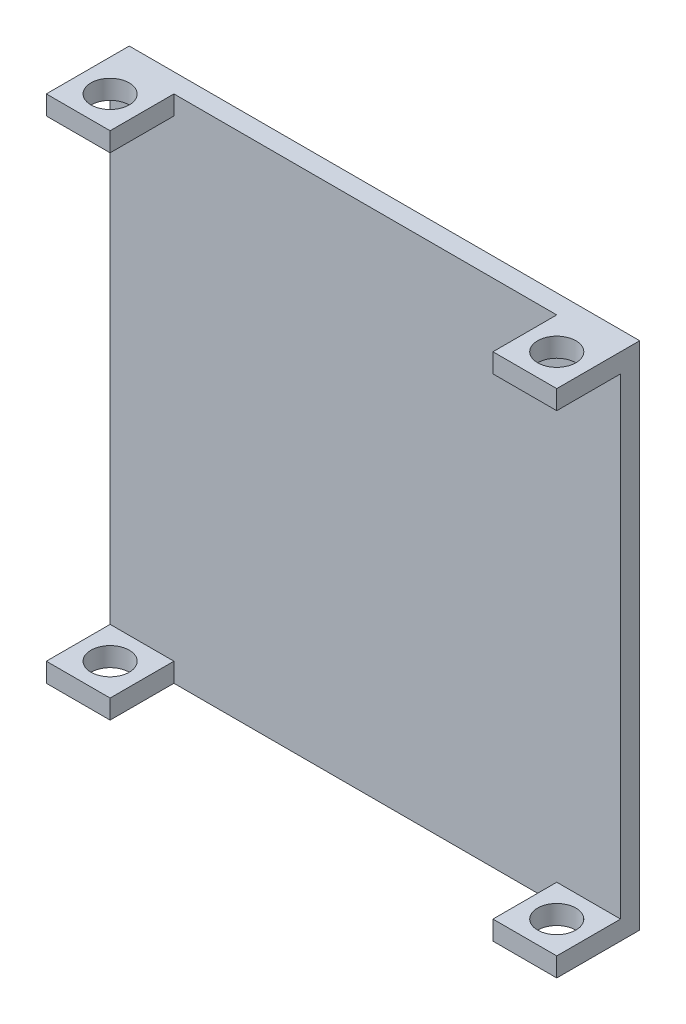
ISO-10303-21;
HEADER;
FILE_DESCRIPTION(('STEP AP214'),'2;1');
FILE_NAME('part.step','',(''),(''),'','','');
FILE_SCHEMA(('AUTOMOTIVE_DESIGN { 1 0 10303 214 1 1 1 1 }'));
ENDSEC;
DATA;
#1=APPLICATION_CONTEXT('core data for automotive mechanical design processes');
#2=APPLICATION_PROTOCOL_DEFINITION('international standard','automotive_design',2000,#1);
#3=PRODUCT_CONTEXT('',#1,'mechanical');
#4=PRODUCT('Part','Part','',(#3));
#5=PRODUCT_RELATED_PRODUCT_CATEGORY('part','',(#4));
#6=PRODUCT_DEFINITION_FORMATION('','',#4);
#7=PRODUCT_DEFINITION_CONTEXT('part definition',#1,'design');
#8=PRODUCT_DEFINITION('design','',#6,#7);
#9=PRODUCT_DEFINITION_SHAPE('','',#8);
#10=(LENGTH_UNIT() NAMED_UNIT(*) SI_UNIT(.MILLI.,.METRE.));
#11=(NAMED_UNIT(*) PLANE_ANGLE_UNIT() SI_UNIT($,.RADIAN.));
#12=(NAMED_UNIT(*) SI_UNIT($,.STERADIAN.) SOLID_ANGLE_UNIT());
#13=UNCERTAINTY_MEASURE_WITH_UNIT(LENGTH_MEASURE(1.E-05),#10,'distance_accuracy_value','');
#14=(GEOMETRIC_REPRESENTATION_CONTEXT(3) GLOBAL_UNCERTAINTY_ASSIGNED_CONTEXT((#13)) GLOBAL_UNIT_ASSIGNED_CONTEXT((#10,
#11,#12)) REPRESENTATION_CONTEXT('',''));
#15=CARTESIAN_POINT('',(0.,0.,0.));
#16=DIRECTION('',(0.,0.,1.));
#17=DIRECTION('',(1.,0.,0.));
#18=AXIS2_PLACEMENT_3D('',#15,#16,#17);
#19=CARTESIAN_POINT('',(0.,0.,3.));
#20=DIRECTION('',(0.,0.,-1.));
#21=DIRECTION('',(-1.,0.,0.));
#22=AXIS2_PLACEMENT_3D('',#19,#20,#21);
#23=PLANE('',#22);
#24=DIRECTION('',(1.,0.,0.));
#25=VECTOR('',#24,1.);
#26=CARTESIAN_POINT('',(40.,-40.,3.));
#27=LINE('',#26,#25);
#28=CARTESIAN_POINT('',(-30.,-40.,3.));
#29=VERTEX_POINT('',#28);
#30=CARTESIAN_POINT('',(30.,-40.,3.));
#31=VERTEX_POINT('',#30);
#32=EDGE_CURVE('E280',#29,#31,#27,.T.);
#33=ORIENTED_EDGE('',*,*,#32,.T.);
#34=DIRECTION('',(0.,-1.,0.));
#35=VECTOR('',#34,1.);
#36=CARTESIAN_POINT('',(30.,-37.,3.));
#37=LINE('',#36,#35);
#38=CARTESIAN_POINT('',(30.,-37.,3.));
#39=VERTEX_POINT('',#38);
#40=EDGE_CURVE('E50',#39,#31,#37,.T.);
#41=ORIENTED_EDGE('',*,*,#40,.F.);
#42=DIRECTION('',(1.,0.,0.));
#43=VECTOR('',#42,1.);
#44=CARTESIAN_POINT('',(40.,-37.,3.));
#45=LINE('',#44,#43);
#46=CARTESIAN_POINT('',(40.,-37.,3.));
#47=VERTEX_POINT('',#46);
#48=EDGE_CURVE('E54',#39,#47,#45,.T.);
#49=ORIENTED_EDGE('',*,*,#48,.T.);
#50=DIRECTION('',(0.,1.,0.));
#51=VECTOR('',#50,1.);
#52=CARTESIAN_POINT('',(40.,40.,3.));
#53=LINE('',#52,#51);
#54=CARTESIAN_POINT('',(40.,37.,3.));
#55=VERTEX_POINT('',#54);
#56=EDGE_CURVE('E168',#47,#55,#53,.T.);
#57=ORIENTED_EDGE('',*,*,#56,.T.);
#58=DIRECTION('',(-1.,0.,0.));
#59=VECTOR('',#58,1.);
#60=CARTESIAN_POINT('',(40.,37.,3.));
#61=LINE('',#60,#59);
#62=CARTESIAN_POINT('',(30.,37.,3.));
#63=VERTEX_POINT('',#62);
#64=EDGE_CURVE('E221',#55,#63,#61,.T.);
#65=ORIENTED_EDGE('',*,*,#64,.T.);
#66=DIRECTION('',(0.,1.,0.));
#67=VECTOR('',#66,1.);
#68=CARTESIAN_POINT('',(30.,37.,3.));
#69=LINE('',#68,#67);
#70=CARTESIAN_POINT('',(30.,40.,3.));
#71=VERTEX_POINT('',#70);
#72=EDGE_CURVE('E230',#63,#71,#69,.T.);
#73=ORIENTED_EDGE('',*,*,#72,.T.);
#74=DIRECTION('',(-1.,0.,0.));
#75=VECTOR('',#74,1.);
#76=CARTESIAN_POINT('',(40.,40.,3.));
#77=LINE('',#76,#75);
#78=CARTESIAN_POINT('',(-30.,40.,3.));
#79=VERTEX_POINT('',#78);
#80=EDGE_CURVE('E275',#71,#79,#77,.T.);
#81=ORIENTED_EDGE('',*,*,#80,.T.);
#82=DIRECTION('',(0.,1.,0.));
#83=VECTOR('',#82,1.);
#84=CARTESIAN_POINT('',(-30.,37.,3.));
#85=LINE('',#84,#83);
#86=CARTESIAN_POINT('',(-30.,37.,3.));
#87=VERTEX_POINT('',#86);
#88=EDGE_CURVE('E266',#87,#79,#85,.T.);
#89=ORIENTED_EDGE('',*,*,#88,.F.);
#90=DIRECTION('',(-1.,0.,0.));
#91=VECTOR('',#90,1.);
#92=CARTESIAN_POINT('',(-40.,37.,3.));
#93=LINE('',#92,#91);
#94=CARTESIAN_POINT('',(-40.,37.,3.));
#95=VERTEX_POINT('',#94);
#96=EDGE_CURVE('E258',#87,#95,#93,.T.);
#97=ORIENTED_EDGE('',*,*,#96,.T.);
#98=DIRECTION('',(0.,-1.,0.));
#99=VECTOR('',#98,1.);
#100=CARTESIAN_POINT('',(-40.,40.,3.));
#101=LINE('',#100,#99);
#102=CARTESIAN_POINT('',(-40.,-37.,3.));
#103=VERTEX_POINT('',#102);
#104=EDGE_CURVE('E278',#95,#103,#101,.T.);
#105=ORIENTED_EDGE('',*,*,#104,.T.);
#106=DIRECTION('',(1.,0.,0.));
#107=VECTOR('',#106,1.);
#108=CARTESIAN_POINT('',(-40.,-37.,3.));
#109=LINE('',#108,#107);
#110=CARTESIAN_POINT('',(-30.,-37.,3.));
#111=VERTEX_POINT('',#110);
#112=EDGE_CURVE('E188',#103,#111,#109,.T.);
#113=ORIENTED_EDGE('',*,*,#112,.T.);
#114=DIRECTION('',(0.,-1.,0.));
#115=VECTOR('',#114,1.);
#116=CARTESIAN_POINT('',(-30.,-37.,3.));
#117=LINE('',#116,#115);
#118=EDGE_CURVE('E200',#111,#29,#117,.T.);
#119=ORIENTED_EDGE('',*,*,#118,.T.);
#120=EDGE_LOOP('',(#33,#41,#49,#57,#65,#73,#81,#89,#97,#105,#113,#119));
#121=FACE_BOUND('',#120,.T.);
#122=ADVANCED_FACE('F35',(#121),#23,.F.);
#123=CARTESIAN_POINT('',(40.,40.,3.));
#124=DIRECTION('',(-1.,0.,0.));
#125=DIRECTION('',(0.,-1.,0.));
#126=AXIS2_PLACEMENT_3D('',#123,#124,#125);
#127=PLANE('',#126);
#128=DIRECTION('',(0.,1.,0.));
#129=VECTOR('',#128,1.);
#130=CARTESIAN_POINT('',(40.,40.,0.));
#131=LINE('',#130,#129);
#132=CARTESIAN_POINT('',(40.,-40.,0.));
#133=VERTEX_POINT('',#132);
#134=CARTESIAN_POINT('',(40.,40.,0.));
#135=VERTEX_POINT('',#134);
#136=EDGE_CURVE('E269',#133,#135,#131,.T.);
#137=ORIENTED_EDGE('',*,*,#136,.T.);
#138=DIRECTION('',(0.,0.,-1.));
#139=VECTOR('',#138,1.);
#140=CARTESIAN_POINT('',(40.,40.,3.));
#141=LINE('',#140,#139);
#142=CARTESIAN_POINT('',(40.,40.,13.));
#143=VERTEX_POINT('',#142);
#144=EDGE_CURVE('E11',#143,#135,#141,.T.);
#145=ORIENTED_EDGE('',*,*,#144,.F.);
#146=DIRECTION('',(0.,1.,0.));
#147=VECTOR('',#146,1.);
#148=CARTESIAN_POINT('',(40.,37.,13.));
#149=LINE('',#148,#147);
#150=CARTESIAN_POINT('',(40.,37.,13.));
#151=VERTEX_POINT('',#150);
#152=EDGE_CURVE('E235',#151,#143,#149,.T.);
#153=ORIENTED_EDGE('',*,*,#152,.F.);
#154=DIRECTION('',(0.,0.,-1.));
#155=VECTOR('',#154,1.);
#156=CARTESIAN_POINT('',(40.,37.,3.));
#157=LINE('',#156,#155);
#158=EDGE_CURVE('E219',#151,#55,#157,.T.);
#159=ORIENTED_EDGE('',*,*,#158,.T.);
#160=ORIENTED_EDGE('',*,*,#56,.F.);
#161=DIRECTION('',(0.,0.,1.));
#162=VECTOR('',#161,1.);
#163=CARTESIAN_POINT('',(40.,-37.,13.));
#164=LINE('',#163,#162);
#165=CARTESIAN_POINT('',(40.,-37.,13.));
#166=VERTEX_POINT('',#165);
#167=EDGE_CURVE('E163',#47,#166,#164,.T.);
#168=ORIENTED_EDGE('',*,*,#167,.T.);
#169=DIRECTION('',(0.,-1.,0.));
#170=VECTOR('',#169,1.);
#171=CARTESIAN_POINT('',(40.,-37.,13.));
#172=LINE('',#171,#170);
#173=CARTESIAN_POINT('',(40.,-40.,13.));
#174=VERTEX_POINT('',#173);
#175=EDGE_CURVE('E147',#166,#174,#172,.T.);
#176=ORIENTED_EDGE('',*,*,#175,.T.);
#177=DIRECTION('',(0.,0.,-1.));
#178=VECTOR('',#177,1.);
#179=CARTESIAN_POINT('',(40.,-40.,3.));
#180=LINE('',#179,#178);
#181=EDGE_CURVE('E282',#174,#133,#180,.T.);
#182=ORIENTED_EDGE('',*,*,#181,.T.);
#183=EDGE_LOOP('',(#137,#145,#153,#159,#160,#168,#176,#182));
#184=FACE_BOUND('',#183,.T.);
#185=ADVANCED_FACE('F37',(#184),#127,.F.);
#186=CARTESIAN_POINT('',(40.,40.,3.));
#187=DIRECTION('',(0.,-1.,0.));
#188=DIRECTION('',(0.,0.,-1.));
#189=AXIS2_PLACEMENT_3D('',#186,#187,#188);
#190=PLANE('',#189);
#191=DIRECTION('',(-1.,0.,0.));
#192=VECTOR('',#191,1.);
#193=CARTESIAN_POINT('',(40.,40.,0.));
#194=LINE('',#193,#192);
#195=CARTESIAN_POINT('',(-40.,40.,0.));
#196=VERTEX_POINT('',#195);
#197=EDGE_CURVE('E284',#135,#196,#194,.T.);
#198=ORIENTED_EDGE('',*,*,#197,.T.);
#199=DIRECTION('',(0.,0.,-1.));
#200=VECTOR('',#199,1.);
#201=CARTESIAN_POINT('',(-40.,40.,3.));
#202=LINE('',#201,#200);
#203=CARTESIAN_POINT('',(-40.,40.,13.));
#204=VERTEX_POINT('',#203);
#205=EDGE_CURVE('E43',#204,#196,#202,.T.);
#206=ORIENTED_EDGE('',*,*,#205,.F.);
#207=DIRECTION('',(1.,0.,0.));
#208=VECTOR('',#207,1.);
#209=CARTESIAN_POINT('',(-40.,40.,13.));
#210=LINE('',#209,#208);
#211=CARTESIAN_POINT('',(-30.,40.,13.));
#212=VERTEX_POINT('',#211);
#213=EDGE_CURVE('E246',#204,#212,#210,.T.);
#214=ORIENTED_EDGE('',*,*,#213,.T.);
#215=DIRECTION('',(0.,0.,-1.));
#216=VECTOR('',#215,1.);
#217=CARTESIAN_POINT('',(-30.,40.,3.));
#218=LINE('',#217,#216);
#219=EDGE_CURVE('E253',#212,#79,#218,.T.);
#220=ORIENTED_EDGE('',*,*,#219,.T.);
#221=ORIENTED_EDGE('',*,*,#80,.F.);
#222=DIRECTION('',(0.,0.,1.));
#223=VECTOR('',#222,1.);
#224=CARTESIAN_POINT('',(30.,40.,3.));
#225=LINE('',#224,#223);
#226=CARTESIAN_POINT('',(30.,40.,13.));
#227=VERTEX_POINT('',#226);
#228=EDGE_CURVE('E216',#71,#227,#225,.T.);
#229=ORIENTED_EDGE('',*,*,#228,.T.);
#230=DIRECTION('',(1.,0.,0.));
#231=VECTOR('',#230,1.);
#232=CARTESIAN_POINT('',(40.,40.,13.));
#233=LINE('',#232,#231);
#234=EDGE_CURVE('E222',#227,#143,#233,.T.);
#235=ORIENTED_EDGE('',*,*,#234,.T.);
#236=ORIENTED_EDGE('',*,*,#144,.T.);
#237=EDGE_LOOP('',(#198,#206,#214,#220,#221,#229,#235,#236));
#238=FACE_BOUND('',#237,.T.);
#239=CARTESIAN_POINT('',(-35.,40.,8.));
#240=DIRECTION('',(0.,1.,0.));
#241=DIRECTION('',(0.,0.,1.));
#242=AXIS2_PLACEMENT_3D('',#239,#240,#241);
#243=CIRCLE('',#242,3.);
#244=CARTESIAN_POINT('',(-35.,40.,11.));
#245=VERTEX_POINT('',#244);
#246=EDGE_CURVE('E238',#245,#245,#243,.T.);
#247=ORIENTED_EDGE('',*,*,#246,.F.);
#248=EDGE_LOOP('',(#247));
#249=FACE_BOUND('',#248,.T.);
#250=CARTESIAN_POINT('',(35.,40.,8.));
#251=DIRECTION('',(0.,1.,0.));
#252=DIRECTION('',(0.,0.,1.));
#253=AXIS2_PLACEMENT_3D('',#250,#251,#252);
#254=CIRCLE('',#253,3.);
#255=CARTESIAN_POINT('',(35.,40.,11.));
#256=VERTEX_POINT('',#255);
#257=EDGE_CURVE('E208',#256,#256,#254,.T.);
#258=ORIENTED_EDGE('',*,*,#257,.F.);
#259=EDGE_LOOP('',(#258));
#260=FACE_BOUND('',#259,.T.);
#261=ADVANCED_FACE('F310',(#238,#249,#260),#190,.F.);
#262=CARTESIAN_POINT('',(-40.,40.,3.));
#263=DIRECTION('',(1.,0.,0.));
#264=DIRECTION('',(0.,1.,0.));
#265=AXIS2_PLACEMENT_3D('',#262,#263,#264);
#266=PLANE('',#265);
#267=DIRECTION('',(0.,-1.,0.));
#268=VECTOR('',#267,1.);
#269=CARTESIAN_POINT('',(-40.,40.,0.));
#270=LINE('',#269,#268);
#271=CARTESIAN_POINT('',(-40.,-40.,0.));
#272=VERTEX_POINT('',#271);
#273=EDGE_CURVE('E286',#196,#272,#270,.T.);
#274=ORIENTED_EDGE('',*,*,#273,.T.);
#275=DIRECTION('',(0.,0.,-1.));
#276=VECTOR('',#275,1.);
#277=CARTESIAN_POINT('',(-40.,-40.,3.));
#278=LINE('',#277,#276);
#279=CARTESIAN_POINT('',(-40.,-40.,13.));
#280=VERTEX_POINT('',#279);
#281=EDGE_CURVE('E290',#280,#272,#278,.T.);
#282=ORIENTED_EDGE('',*,*,#281,.F.);
#283=DIRECTION('',(0.,-1.,0.));
#284=VECTOR('',#283,1.);
#285=CARTESIAN_POINT('',(-40.,-37.,13.));
#286=LINE('',#285,#284);
#287=CARTESIAN_POINT('',(-40.,-37.,13.));
#288=VERTEX_POINT('',#287);
#289=EDGE_CURVE('E205',#288,#280,#286,.T.);
#290=ORIENTED_EDGE('',*,*,#289,.F.);
#291=DIRECTION('',(0.,0.,-1.));
#292=VECTOR('',#291,1.);
#293=CARTESIAN_POINT('',(-40.,-37.,13.));
#294=LINE('',#293,#292);
#295=EDGE_CURVE('E197',#288,#103,#294,.T.);
#296=ORIENTED_EDGE('',*,*,#295,.T.);
#297=ORIENTED_EDGE('',*,*,#104,.F.);
#298=DIRECTION('',(0.,0.,1.));
#299=VECTOR('',#298,1.);
#300=CARTESIAN_POINT('',(-40.,37.,3.));
#301=LINE('',#300,#299);
#302=CARTESIAN_POINT('',(-40.,37.,13.));
#303=VERTEX_POINT('',#302);
#304=EDGE_CURVE('E249',#95,#303,#301,.T.);
#305=ORIENTED_EDGE('',*,*,#304,.T.);
#306=DIRECTION('',(0.,1.,0.));
#307=VECTOR('',#306,1.);
#308=CARTESIAN_POINT('',(-40.,37.,13.));
#309=LINE('',#308,#307);
#310=EDGE_CURVE('E261',#303,#204,#309,.T.);
#311=ORIENTED_EDGE('',*,*,#310,.T.);
#312=ORIENTED_EDGE('',*,*,#205,.T.);
#313=EDGE_LOOP('',(#274,#282,#290,#296,#297,#305,#311,#312));
#314=FACE_BOUND('',#313,.T.);
#315=ADVANCED_FACE('F295',(#314),#266,.F.);
#316=CARTESIAN_POINT('',(40.,-40.,3.));
#317=DIRECTION('',(0.,1.,0.));
#318=DIRECTION('',(-1.,0.,0.));
#319=AXIS2_PLACEMENT_3D('',#316,#317,#318);
#320=PLANE('',#319);
#321=DIRECTION('',(1.,0.,0.));
#322=VECTOR('',#321,1.);
#323=CARTESIAN_POINT('',(40.,-40.,0.));
#324=LINE('',#323,#322);
#325=EDGE_CURVE('E276',#272,#133,#324,.T.);
#326=ORIENTED_EDGE('',*,*,#325,.T.);
#327=ORIENTED_EDGE('',*,*,#181,.F.);
#328=DIRECTION('',(-1.,0.,0.));
#329=VECTOR('',#328,1.);
#330=CARTESIAN_POINT('',(30.,-40.,13.));
#331=LINE('',#330,#329);
#332=CARTESIAN_POINT('',(30.,-40.,13.));
#333=VERTEX_POINT('',#332);
#334=EDGE_CURVE('E153',#174,#333,#331,.T.);
#335=ORIENTED_EDGE('',*,*,#334,.T.);
#336=DIRECTION('',(0.,0.,-1.));
#337=VECTOR('',#336,1.);
#338=CARTESIAN_POINT('',(30.,-40.,3.));
#339=LINE('',#338,#337);
#340=EDGE_CURVE('E170',#333,#31,#339,.T.);
#341=ORIENTED_EDGE('',*,*,#340,.T.);
#342=ORIENTED_EDGE('',*,*,#32,.F.);
#343=DIRECTION('',(0.,0.,1.));
#344=VECTOR('',#343,1.);
#345=CARTESIAN_POINT('',(-30.,-40.,3.));
#346=LINE('',#345,#344);
#347=CARTESIAN_POINT('',(-30.,-40.,13.));
#348=VERTEX_POINT('',#347);
#349=EDGE_CURVE('E185',#29,#348,#346,.T.);
#350=ORIENTED_EDGE('',*,*,#349,.T.);
#351=DIRECTION('',(-1.,0.,0.));
#352=VECTOR('',#351,1.);
#353=CARTESIAN_POINT('',(-30.,-40.,13.));
#354=LINE('',#353,#352);
#355=EDGE_CURVE('E191',#348,#280,#354,.T.);
#356=ORIENTED_EDGE('',*,*,#355,.T.);
#357=ORIENTED_EDGE('',*,*,#281,.T.);
#358=EDGE_LOOP('',(#326,#327,#335,#341,#342,#350,#356,#357));
#359=FACE_BOUND('',#358,.T.);
#360=CARTESIAN_POINT('',(-35.,-40.,8.));
#361=DIRECTION('',(0.,-1.,0.));
#362=DIRECTION('',(1.,0.,0.));
#363=AXIS2_PLACEMENT_3D('',#360,#361,#362);
#364=CIRCLE('',#363,3.);
#365=CARTESIAN_POINT('',(-32.,-40.,8.));
#366=VERTEX_POINT('',#365);
#367=EDGE_CURVE('E180',#366,#366,#364,.T.);
#368=ORIENTED_EDGE('',*,*,#367,.F.);
#369=EDGE_LOOP('',(#368));
#370=FACE_BOUND('',#369,.T.);
#371=CARTESIAN_POINT('',(35.,-40.,8.));
#372=DIRECTION('',(0.,-1.,0.));
#373=DIRECTION('',(1.,0.,0.));
#374=AXIS2_PLACEMENT_3D('',#371,#372,#373);
#375=CIRCLE('',#374,3.);
#376=CARTESIAN_POINT('',(38.,-40.,8.));
#377=VERTEX_POINT('',#376);
#378=EDGE_CURVE('E501',#377,#377,#375,.T.);
#379=ORIENTED_EDGE('',*,*,#378,.F.);
#380=EDGE_LOOP('',(#379));
#381=FACE_BOUND('',#380,.T.);
#382=ADVANCED_FACE('F303',(#359,#370,#381),#320,.F.);
#383=CARTESIAN_POINT('',(0.,0.,0.));
#384=DIRECTION('',(0.,0.,-1.));
#385=DIRECTION('',(-1.,0.,0.));
#386=AXIS2_PLACEMENT_3D('',#383,#384,#385);
#387=PLANE('',#386);
#388=ORIENTED_EDGE('',*,*,#136,.F.);
#389=ORIENTED_EDGE('',*,*,#325,.F.);
#390=ORIENTED_EDGE('',*,*,#273,.F.);
#391=ORIENTED_EDGE('',*,*,#197,.F.);
#392=EDGE_LOOP('',(#388,#389,#390,#391));
#393=FACE_BOUND('',#392,.T.);
#394=ADVANCED_FACE('F301',(#393),#387,.T.);
#395=CARTESIAN_POINT('',(-30.,37.,3.));
#396=DIRECTION('',(1.,0.,0.));
#397=DIRECTION('',(0.,0.,-1.));
#398=AXIS2_PLACEMENT_3D('',#395,#396,#397);
#399=PLANE('',#398);
#400=ORIENTED_EDGE('',*,*,#219,.F.);
#401=DIRECTION('',(0.,1.,0.));
#402=VECTOR('',#401,1.);
#403=CARTESIAN_POINT('',(-30.,37.,13.));
#404=LINE('',#403,#402);
#405=CARTESIAN_POINT('',(-30.,37.,13.));
#406=VERTEX_POINT('',#405);
#407=EDGE_CURVE('E270',#406,#212,#404,.T.);
#408=ORIENTED_EDGE('',*,*,#407,.F.);
#409=DIRECTION('',(0.,0.,-1.));
#410=VECTOR('',#409,1.);
#411=CARTESIAN_POINT('',(-30.,37.,3.));
#412=LINE('',#411,#410);
#413=EDGE_CURVE('E256',#406,#87,#412,.T.);
#414=ORIENTED_EDGE('',*,*,#413,.T.);
#415=ORIENTED_EDGE('',*,*,#88,.T.);
#416=EDGE_LOOP('',(#400,#408,#414,#415));
#417=FACE_BOUND('',#416,.T.);
#418=ADVANCED_FACE('F323',(#417),#399,.T.);
#419=CARTESIAN_POINT('',(-40.,37.,13.));
#420=DIRECTION('',(0.,0.,1.));
#421=DIRECTION('',(1.,0.,0.));
#422=AXIS2_PLACEMENT_3D('',#419,#420,#421);
#423=PLANE('',#422);
#424=ORIENTED_EDGE('',*,*,#213,.F.);
#425=ORIENTED_EDGE('',*,*,#310,.F.);
#426=DIRECTION('',(1.,0.,0.));
#427=VECTOR('',#426,1.);
#428=CARTESIAN_POINT('',(-40.,37.,13.));
#429=LINE('',#428,#427);
#430=EDGE_CURVE('E252',#303,#406,#429,.T.);
#431=ORIENTED_EDGE('',*,*,#430,.T.);
#432=ORIENTED_EDGE('',*,*,#407,.T.);
#433=EDGE_LOOP('',(#424,#425,#431,#432));
#434=FACE_BOUND('',#433,.T.);
#435=ADVANCED_FACE('F327',(#434),#423,.T.);
#436=CARTESIAN_POINT('',(0.,37.,0.));
#437=DIRECTION('',(0.,1.,0.));
#438=DIRECTION('',(0.,0.,1.));
#439=AXIS2_PLACEMENT_3D('',#436,#437,#438);
#440=PLANE('',#439);
#441=CARTESIAN_POINT('',(-35.,37.,8.));
#442=DIRECTION('',(0.,1.,0.));
#443=DIRECTION('',(0.,0.,1.));
#444=AXIS2_PLACEMENT_3D('',#441,#442,#443);
#445=CIRCLE('',#444,3.);
#446=CARTESIAN_POINT('',(-35.,37.,11.));
#447=VERTEX_POINT('',#446);
#448=EDGE_CURVE('E243',#447,#447,#445,.T.);
#449=ORIENTED_EDGE('',*,*,#448,.T.);
#450=EDGE_LOOP('',(#449));
#451=FACE_BOUND('',#450,.T.);
#452=ORIENTED_EDGE('',*,*,#304,.F.);
#453=ORIENTED_EDGE('',*,*,#96,.F.);
#454=ORIENTED_EDGE('',*,*,#413,.F.);
#455=ORIENTED_EDGE('',*,*,#430,.F.);
#456=EDGE_LOOP('',(#452,#453,#454,#455));
#457=FACE_BOUND('',#456,.T.);
#458=ADVANCED_FACE('F330',(#451,#457),#440,.F.);
#459=CARTESIAN_POINT('',(-35.,37.,8.));
#460=DIRECTION('',(0.,1.,0.));
#461=DIRECTION('',(0.,0.,1.));
#462=AXIS2_PLACEMENT_3D('',#459,#460,#461);
#463=CYLINDRICAL_SURFACE('',#462,3.);
#464=ORIENTED_EDGE('',*,*,#448,.F.);
#465=EDGE_LOOP('',(#464));
#466=FACE_BOUND('',#465,.T.);
#467=ORIENTED_EDGE('',*,*,#246,.T.);
#468=EDGE_LOOP('',(#467));
#469=FACE_BOUND('',#468,.T.);
#470=ADVANCED_FACE('F404',(#466,#469),#463,.F.);
#471=CARTESIAN_POINT('',(40.,37.,13.));
#472=DIRECTION('',(0.,0.,1.));
#473=DIRECTION('',(1.,0.,0.));
#474=AXIS2_PLACEMENT_3D('',#471,#472,#473);
#475=PLANE('',#474);
#476=ORIENTED_EDGE('',*,*,#234,.F.);
#477=DIRECTION('',(0.,1.,0.));
#478=VECTOR('',#477,1.);
#479=CARTESIAN_POINT('',(30.,37.,13.));
#480=LINE('',#479,#478);
#481=CARTESIAN_POINT('',(30.,37.,13.));
#482=VERTEX_POINT('',#481);
#483=EDGE_CURVE('E239',#482,#227,#480,.T.);
#484=ORIENTED_EDGE('',*,*,#483,.F.);
#485=DIRECTION('',(1.,0.,0.));
#486=VECTOR('',#485,1.);
#487=CARTESIAN_POINT('',(40.,37.,13.));
#488=LINE('',#487,#486);
#489=EDGE_CURVE('E227',#482,#151,#488,.T.);
#490=ORIENTED_EDGE('',*,*,#489,.T.);
#491=ORIENTED_EDGE('',*,*,#152,.T.);
#492=EDGE_LOOP('',(#476,#484,#490,#491));
#493=FACE_BOUND('',#492,.T.);
#494=ADVANCED_FACE('F308',(#493),#475,.T.);
#495=CARTESIAN_POINT('',(30.,37.,3.));
#496=DIRECTION('',(-1.,0.,0.));
#497=DIRECTION('',(0.,0.,1.));
#498=AXIS2_PLACEMENT_3D('',#495,#496,#497);
#499=PLANE('',#498);
#500=ORIENTED_EDGE('',*,*,#228,.F.);
#501=ORIENTED_EDGE('',*,*,#72,.F.);
#502=DIRECTION('',(0.,0.,1.));
#503=VECTOR('',#502,1.);
#504=CARTESIAN_POINT('',(30.,37.,3.));
#505=LINE('',#504,#503);
#506=EDGE_CURVE('E224',#63,#482,#505,.T.);
#507=ORIENTED_EDGE('',*,*,#506,.T.);
#508=ORIENTED_EDGE('',*,*,#483,.T.);
#509=EDGE_LOOP('',(#500,#501,#507,#508));
#510=FACE_BOUND('',#509,.T.);
#511=ADVANCED_FACE('F315',(#510),#499,.T.);
#512=CARTESIAN_POINT('',(0.,37.,0.));
#513=DIRECTION('',(0.,-1.,0.));
#514=DIRECTION('',(0.,0.,-1.));
#515=AXIS2_PLACEMENT_3D('',#512,#513,#514);
#516=PLANE('',#515);
#517=CARTESIAN_POINT('',(35.,37.,8.));
#518=DIRECTION('',(0.,1.,0.));
#519=DIRECTION('',(0.,0.,1.));
#520=AXIS2_PLACEMENT_3D('',#517,#518,#519);
#521=CIRCLE('',#520,3.);
#522=CARTESIAN_POINT('',(35.,37.,11.));
#523=VERTEX_POINT('',#522);
#524=EDGE_CURVE('E213',#523,#523,#521,.T.);
#525=ORIENTED_EDGE('',*,*,#524,.T.);
#526=EDGE_LOOP('',(#525));
#527=FACE_BOUND('',#526,.T.);
#528=ORIENTED_EDGE('',*,*,#158,.F.);
#529=ORIENTED_EDGE('',*,*,#489,.F.);
#530=ORIENTED_EDGE('',*,*,#506,.F.);
#531=ORIENTED_EDGE('',*,*,#64,.F.);
#532=EDGE_LOOP('',(#528,#529,#530,#531));
#533=FACE_BOUND('',#532,.T.);
#534=ADVANCED_FACE('F319',(#527,#533),#516,.T.);
#535=CARTESIAN_POINT('',(35.,37.,8.));
#536=DIRECTION('',(0.,1.,0.));
#537=DIRECTION('',(0.,0.,1.));
#538=AXIS2_PLACEMENT_3D('',#535,#536,#537);
#539=CYLINDRICAL_SURFACE('',#538,3.);
#540=ORIENTED_EDGE('',*,*,#524,.F.);
#541=EDGE_LOOP('',(#540));
#542=FACE_BOUND('',#541,.T.);
#543=ORIENTED_EDGE('',*,*,#257,.T.);
#544=EDGE_LOOP('',(#543));
#545=FACE_BOUND('',#544,.T.);
#546=ADVANCED_FACE('F431',(#542,#545),#539,.F.);
#547=CARTESIAN_POINT('',(-30.,-37.,13.));
#548=DIRECTION('',(0.,0.,1.));
#549=DIRECTION('',(1.,0.,0.));
#550=AXIS2_PLACEMENT_3D('',#547,#548,#549);
#551=PLANE('',#550);
#552=ORIENTED_EDGE('',*,*,#355,.F.);
#553=DIRECTION('',(0.,-1.,0.));
#554=VECTOR('',#553,1.);
#555=CARTESIAN_POINT('',(-30.,-37.,13.));
#556=LINE('',#555,#554);
#557=CARTESIAN_POINT('',(-30.,-37.,13.));
#558=VERTEX_POINT('',#557);
#559=EDGE_CURVE('E209',#558,#348,#556,.T.);
#560=ORIENTED_EDGE('',*,*,#559,.F.);
#561=DIRECTION('',(-1.,0.,0.));
#562=VECTOR('',#561,1.);
#563=CARTESIAN_POINT('',(-30.,-37.,13.));
#564=LINE('',#563,#562);
#565=EDGE_CURVE('E194',#558,#288,#564,.T.);
#566=ORIENTED_EDGE('',*,*,#565,.T.);
#567=ORIENTED_EDGE('',*,*,#289,.T.);
#568=EDGE_LOOP('',(#552,#560,#566,#567));
#569=FACE_BOUND('',#568,.T.);
#570=ADVANCED_FACE('F439',(#569),#551,.T.);
#571=CARTESIAN_POINT('',(-30.,-37.,3.));
#572=DIRECTION('',(1.,0.,0.));
#573=DIRECTION('',(0.,1.,0.));
#574=AXIS2_PLACEMENT_3D('',#571,#572,#573);
#575=PLANE('',#574);
#576=ORIENTED_EDGE('',*,*,#349,.F.);
#577=ORIENTED_EDGE('',*,*,#118,.F.);
#578=DIRECTION('',(0.,0.,1.));
#579=VECTOR('',#578,1.);
#580=CARTESIAN_POINT('',(-30.,-37.,3.));
#581=LINE('',#580,#579);
#582=EDGE_CURVE('E190',#111,#558,#581,.T.);
#583=ORIENTED_EDGE('',*,*,#582,.T.);
#584=ORIENTED_EDGE('',*,*,#559,.T.);
#585=EDGE_LOOP('',(#576,#577,#583,#584));
#586=FACE_BOUND('',#585,.T.);
#587=ADVANCED_FACE('F341',(#586),#575,.T.);
#588=CARTESIAN_POINT('',(0.,-37.,0.));
#589=DIRECTION('',(0.,-1.,0.));
#590=DIRECTION('',(1.,0.,0.));
#591=AXIS2_PLACEMENT_3D('',#588,#589,#590);
#592=PLANE('',#591);
#593=CARTESIAN_POINT('',(-35.,-37.,8.));
#594=DIRECTION('',(0.,-1.,0.));
#595=DIRECTION('',(1.,0.,0.));
#596=AXIS2_PLACEMENT_3D('',#593,#594,#595);
#597=CIRCLE('',#596,3.);
#598=CARTESIAN_POINT('',(-32.,-37.,8.));
#599=VERTEX_POINT('',#598);
#600=EDGE_CURVE('E182',#599,#599,#597,.T.);
#601=ORIENTED_EDGE('',*,*,#600,.T.);
#602=EDGE_LOOP('',(#601));
#603=FACE_BOUND('',#602,.T.);
#604=ORIENTED_EDGE('',*,*,#112,.F.);
#605=ORIENTED_EDGE('',*,*,#295,.F.);
#606=ORIENTED_EDGE('',*,*,#565,.F.);
#607=ORIENTED_EDGE('',*,*,#582,.F.);
#608=EDGE_LOOP('',(#604,#605,#606,#607));
#609=FACE_BOUND('',#608,.T.);
#610=ADVANCED_FACE('F336',(#603,#609),#592,.F.);
#611=CARTESIAN_POINT('',(-35.,-37.,8.));
#612=DIRECTION('',(0.,-1.,0.));
#613=DIRECTION('',(1.,0.,0.));
#614=AXIS2_PLACEMENT_3D('',#611,#612,#613);
#615=CYLINDRICAL_SURFACE('',#614,3.);
#616=ORIENTED_EDGE('',*,*,#600,.F.);
#617=EDGE_LOOP('',(#616));
#618=FACE_BOUND('',#617,.T.);
#619=ORIENTED_EDGE('',*,*,#367,.T.);
#620=EDGE_LOOP('',(#619));
#621=FACE_BOUND('',#620,.T.);
#622=ADVANCED_FACE('F347',(#618,#621),#615,.F.);
#623=CARTESIAN_POINT('',(30.,-37.,3.));
#624=DIRECTION('',(-1.,0.,0.));
#625=DIRECTION('',(0.,-1.,0.));
#626=AXIS2_PLACEMENT_3D('',#623,#624,#625);
#627=PLANE('',#626);
#628=ORIENTED_EDGE('',*,*,#340,.F.);
#629=DIRECTION('',(0.,-1.,0.));
#630=VECTOR('',#629,1.);
#631=CARTESIAN_POINT('',(30.,-37.,13.));
#632=LINE('',#631,#630);
#633=CARTESIAN_POINT('',(30.,-37.,13.));
#634=VERTEX_POINT('',#633);
#635=EDGE_CURVE('E157',#634,#333,#632,.T.);
#636=ORIENTED_EDGE('',*,*,#635,.F.);
#637=DIRECTION('',(0.,0.,-1.));
#638=VECTOR('',#637,1.);
#639=CARTESIAN_POINT('',(30.,-37.,3.));
#640=LINE('',#639,#638);
#641=EDGE_CURVE('E158',#634,#39,#640,.T.);
#642=ORIENTED_EDGE('',*,*,#641,.T.);
#643=ORIENTED_EDGE('',*,*,#40,.T.);
#644=EDGE_LOOP('',(#628,#636,#642,#643));
#645=FACE_BOUND('',#644,.T.);
#646=ADVANCED_FACE('F345',(#645),#627,.T.);
#647=CARTESIAN_POINT('',(30.,-37.,13.));
#648=DIRECTION('',(0.,0.,1.));
#649=DIRECTION('',(1.,0.,0.));
#650=AXIS2_PLACEMENT_3D('',#647,#648,#649);
#651=PLANE('',#650);
#652=ORIENTED_EDGE('',*,*,#334,.F.);
#653=ORIENTED_EDGE('',*,*,#175,.F.);
#654=DIRECTION('',(-1.,0.,0.));
#655=VECTOR('',#654,1.);
#656=CARTESIAN_POINT('',(30.,-37.,13.));
#657=LINE('',#656,#655);
#658=EDGE_CURVE('E150',#166,#634,#657,.T.);
#659=ORIENTED_EDGE('',*,*,#658,.T.);
#660=ORIENTED_EDGE('',*,*,#635,.T.);
#661=EDGE_LOOP('',(#652,#653,#659,#660));
#662=FACE_BOUND('',#661,.T.);
#663=ADVANCED_FACE('F149',(#662),#651,.T.);
#664=CARTESIAN_POINT('',(0.,-37.,0.));
#665=DIRECTION('',(0.,1.,0.));
#666=DIRECTION('',(-1.,0.,0.));
#667=AXIS2_PLACEMENT_3D('',#664,#665,#666);
#668=PLANE('',#667);
#669=CARTESIAN_POINT('',(35.,-37.,8.));
#670=DIRECTION('',(0.,-1.,0.));
#671=DIRECTION('',(1.,0.,0.));
#672=AXIS2_PLACEMENT_3D('',#669,#670,#671);
#673=CIRCLE('',#672,3.);
#674=CARTESIAN_POINT('',(38.,-37.,8.));
#675=VERTEX_POINT('',#674);
#676=EDGE_CURVE('E176',#675,#675,#673,.T.);
#677=ORIENTED_EDGE('',*,*,#676,.T.);
#678=EDGE_LOOP('',(#677));
#679=FACE_BOUND('',#678,.T.);
#680=ORIENTED_EDGE('',*,*,#48,.F.);
#681=ORIENTED_EDGE('',*,*,#641,.F.);
#682=ORIENTED_EDGE('',*,*,#658,.F.);
#683=ORIENTED_EDGE('',*,*,#167,.F.);
#684=EDGE_LOOP('',(#680,#681,#682,#683));
#685=FACE_BOUND('',#684,.T.);
#686=ADVANCED_FACE('F162',(#679,#685),#668,.T.);
#687=CARTESIAN_POINT('',(35.,-37.,8.));
#688=DIRECTION('',(0.,-1.,0.));
#689=DIRECTION('',(1.,0.,0.));
#690=AXIS2_PLACEMENT_3D('',#687,#688,#689);
#691=CYLINDRICAL_SURFACE('',#690,3.);
#692=ORIENTED_EDGE('',*,*,#676,.F.);
#693=EDGE_LOOP('',(#692));
#694=FACE_BOUND('',#693,.T.);
#695=ORIENTED_EDGE('',*,*,#378,.T.);
#696=EDGE_LOOP('',(#695));
#697=FACE_BOUND('',#696,.T.);
#698=ADVANCED_FACE('F483',(#694,#697),#691,.F.);
#699=CLOSED_SHELL('',(#122,#185,#261,#315,#382,#394,#418,#435,#458,#470,#494,#511,#534,#546,
#570,#587,#610,#622,#646,#663,#686,#698));
#700=MANIFOLD_SOLID_BREP('B2',#699);
#701=ADVANCED_BREP_SHAPE_REPRESENTATION('',(#18,#700),#14);
#702=SHAPE_DEFINITION_REPRESENTATION(#9,#701);
ENDSEC;
END-ISO-10303-21;
